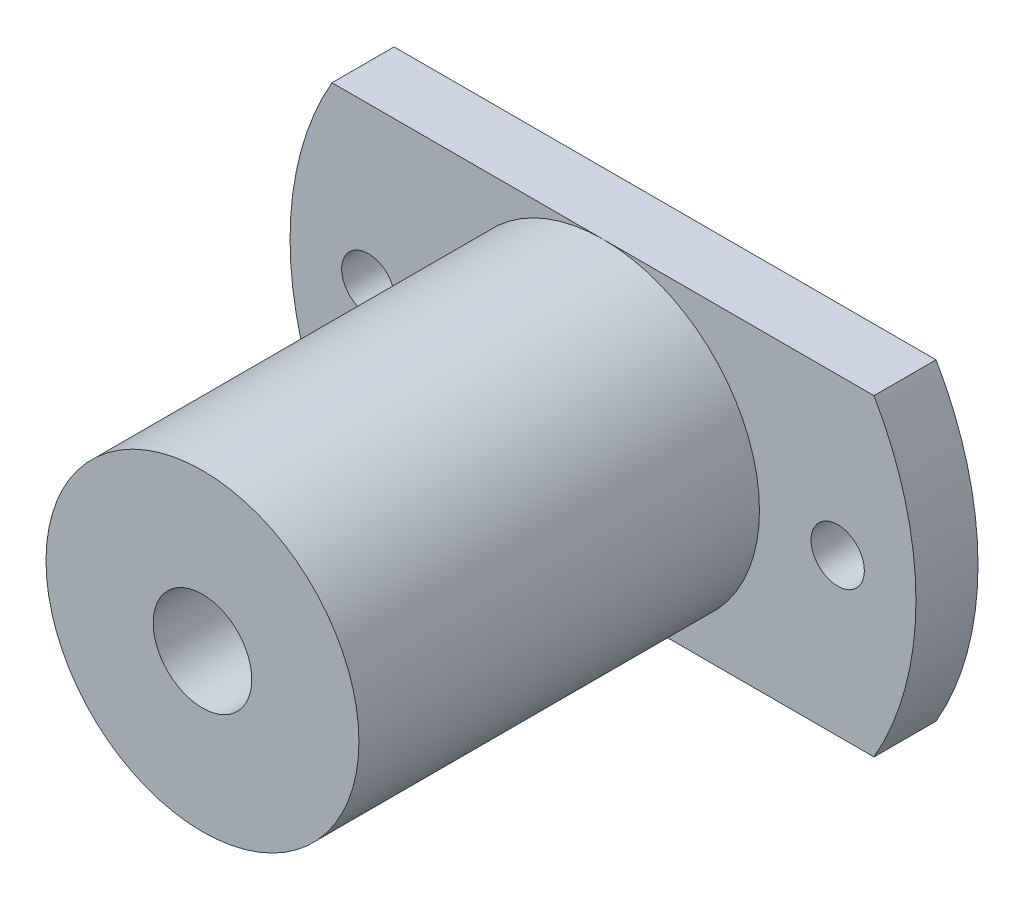
ISO-10303-21;
HEADER;
FILE_DESCRIPTION(('STEP AP214'),'2;1');
FILE_NAME('part.step','',(''),(''),'','','');
FILE_SCHEMA(('AUTOMOTIVE_DESIGN { 1 0 10303 214 1 1 1 1 }'));
ENDSEC;
DATA;
#1=APPLICATION_CONTEXT('core data for automotive mechanical design processes');
#2=APPLICATION_PROTOCOL_DEFINITION('international standard','automotive_design',2000,#1);
#3=PRODUCT_CONTEXT('',#1,'mechanical');
#4=PRODUCT('Part','Part','',(#3));
#5=PRODUCT_RELATED_PRODUCT_CATEGORY('part','',(#4));
#6=PRODUCT_DEFINITION_FORMATION('','',#4);
#7=PRODUCT_DEFINITION_CONTEXT('part definition',#1,'design');
#8=PRODUCT_DEFINITION('design','',#6,#7);
#9=PRODUCT_DEFINITION_SHAPE('','',#8);
#10=(LENGTH_UNIT() NAMED_UNIT(*) SI_UNIT(.MILLI.,.METRE.));
#11=(NAMED_UNIT(*) PLANE_ANGLE_UNIT() SI_UNIT($,.RADIAN.));
#12=(NAMED_UNIT(*) SI_UNIT($,.STERADIAN.) SOLID_ANGLE_UNIT());
#13=UNCERTAINTY_MEASURE_WITH_UNIT(LENGTH_MEASURE(1.E-05),#10,'distance_accuracy_value','');
#14=(GEOMETRIC_REPRESENTATION_CONTEXT(3) GLOBAL_UNCERTAINTY_ASSIGNED_CONTEXT((#13)) GLOBAL_UNIT_ASSIGNED_CONTEXT((#10,
#11,#12)) REPRESENTATION_CONTEXT('',''));
#15=CARTESIAN_POINT('',(0.,0.,0.));
#16=DIRECTION('',(0.,0.,1.));
#17=DIRECTION('',(1.,0.,0.));
#18=AXIS2_PLACEMENT_3D('',#15,#16,#17);
#19=CARTESIAN_POINT('',(0.,0.,23.4696));
#20=DIRECTION('',(0.,0.,-1.));
#21=DIRECTION('',(-1.,0.,0.));
#22=AXIS2_PLACEMENT_3D('',#19,#20,#21);
#23=CYLINDRICAL_SURFACE('',#22,15.875);
#24=CARTESIAN_POINT('',(0.,0.,3.1496));
#25=DIRECTION('',(0.,0.,1.));
#26=DIRECTION('',(1.,0.,0.));
#27=AXIS2_PLACEMENT_3D('',#24,#25,#26);
#28=CIRCLE('',#27,15.875);
#29=CARTESIAN_POINT('',(13.748153285078,-7.9375,3.1496));
#30=VERTEX_POINT('',#29);
#31=CARTESIAN_POINT('',(13.748153285078,7.9375,3.1496));
#32=VERTEX_POINT('',#31);
#33=EDGE_CURVE('E97',#30,#32,#28,.T.);
#34=ORIENTED_EDGE('',*,*,#33,.F.);
#35=DIRECTION('',(0.,0.,1.));
#36=VECTOR('',#35,1.);
#37=CARTESIAN_POINT('',(13.748153285078,-7.9375,0.));
#38=LINE('',#37,#36);
#39=CARTESIAN_POINT('',(13.748153285078,-7.9375,0.));
#40=VERTEX_POINT('',#39);
#41=EDGE_CURVE('E86',#40,#30,#38,.T.);
#42=ORIENTED_EDGE('',*,*,#41,.F.);
#43=CARTESIAN_POINT('',(0.,0.,0.));
#44=DIRECTION('',(0.,0.,1.));
#45=DIRECTION('',(1.,0.,0.));
#46=AXIS2_PLACEMENT_3D('',#43,#44,#45);
#47=CIRCLE('',#46,15.875);
#48=CARTESIAN_POINT('',(13.748153285078,7.9375,0.));
#49=VERTEX_POINT('',#48);
#50=EDGE_CURVE('E45',#40,#49,#47,.T.);
#51=ORIENTED_EDGE('',*,*,#50,.T.);
#52=DIRECTION('',(0.,0.,1.));
#53=VECTOR('',#52,1.);
#54=CARTESIAN_POINT('',(13.748153285078,7.9375,0.));
#55=LINE('',#54,#53);
#56=EDGE_CURVE('E132',#49,#32,#55,.T.);
#57=ORIENTED_EDGE('',*,*,#56,.T.);
#58=EDGE_LOOP('',(#34,#42,#51,#57));
#59=FACE_BOUND('',#58,.T.);
#60=ADVANCED_FACE('F37',(#59),#23,.T.);
#61=CARTESIAN_POINT('',(0.,0.,3.1496));
#62=DIRECTION('',(0.,0.,1.));
#63=DIRECTION('',(1.,0.,0.));
#64=AXIS2_PLACEMENT_3D('',#61,#62,#63);
#65=PLANE('',#64);
#66=DIRECTION('',(-1.,0.,0.));
#67=VECTOR('',#66,1.);
#68=CARTESIAN_POINT('',(-13.748153285078,-7.9375,3.1496));
#69=LINE('',#68,#67);
#70=CARTESIAN_POINT('',(0.,-7.9375,3.1496));
#71=VERTEX_POINT('',#70);
#72=EDGE_CURVE('E52',#30,#71,#69,.T.);
#73=ORIENTED_EDGE('',*,*,#72,.F.);
#74=ORIENTED_EDGE('',*,*,#33,.T.);
#75=DIRECTION('',(1.,0.,0.));
#76=VECTOR('',#75,1.);
#77=CARTESIAN_POINT('',(0.,7.9375,3.1496));
#78=LINE('',#77,#76);
#79=CARTESIAN_POINT('',(0.,7.9375,3.1496));
#80=VERTEX_POINT('',#79);
#81=EDGE_CURVE('E137',#80,#32,#78,.T.);
#82=ORIENTED_EDGE('',*,*,#81,.F.);
#83=CARTESIAN_POINT('',(0.,0.,3.1496));
#84=DIRECTION('',(0.,0.,1.));
#85=DIRECTION('',(1.,0.,0.));
#86=AXIS2_PLACEMENT_3D('',#83,#84,#85);
#87=CIRCLE('',#86,7.9375);
#88=EDGE_CURVE('E59',#71,#80,#87,.T.);
#89=ORIENTED_EDGE('',*,*,#88,.F.);
#90=EDGE_LOOP('',(#73,#74,#82,#89));
#91=FACE_BOUND('',#90,.T.);
#92=CARTESIAN_POINT('',(11.90625,0.,3.1496));
#93=DIRECTION('',(0.,0.,1.));
#94=DIRECTION('',(1.,0.,0.));
#95=AXIS2_PLACEMENT_3D('',#92,#93,#94);
#96=CIRCLE('',#95,1.35254999999999);
#97=CARTESIAN_POINT('',(13.2588,0.,3.1496));
#98=VERTEX_POINT('',#97);
#99=EDGE_CURVE('E128',#98,#98,#96,.T.);
#100=ORIENTED_EDGE('',*,*,#99,.F.);
#101=EDGE_LOOP('',(#100));
#102=FACE_BOUND('',#101,.T.);
#103=ADVANCED_FACE('F170',(#91,#102),#65,.T.);
#104=CARTESIAN_POINT('',(-13.748153285078,7.9375,0.));
#105=VERTEX_POINT('',#104);
#106=CARTESIAN_POINT('',(-13.748153285078,-7.9375,0.));
#107=VERTEX_POINT('',#106);
#108=EDGE_CURVE('E11',#105,#107,#47,.T.);
#109=ORIENTED_EDGE('',*,*,#108,.T.);
#110=DIRECTION('',(0.,0.,1.));
#111=VECTOR('',#110,1.);
#112=CARTESIAN_POINT('',(-13.748153285078,-7.9375,0.));
#113=LINE('',#112,#111);
#114=CARTESIAN_POINT('',(-13.748153285078,-7.9375,3.1496));
#115=VERTEX_POINT('',#114);
#116=EDGE_CURVE('E88',#107,#115,#113,.T.);
#117=ORIENTED_EDGE('',*,*,#116,.T.);
#118=CARTESIAN_POINT('',(-13.748153285078,7.9375,3.1496));
#119=VERTEX_POINT('',#118);
#120=EDGE_CURVE('E102',#119,#115,#28,.T.);
#121=ORIENTED_EDGE('',*,*,#120,.F.);
#122=DIRECTION('',(0.,0.,1.));
#123=VECTOR('',#122,1.);
#124=CARTESIAN_POINT('',(-13.748153285078,7.9375,0.));
#125=LINE('',#124,#123);
#126=EDGE_CURVE('E131',#105,#119,#125,.T.);
#127=ORIENTED_EDGE('',*,*,#126,.F.);
#128=EDGE_LOOP('',(#109,#117,#121,#127));
#129=FACE_BOUND('',#128,.T.);
#130=ADVANCED_FACE('F39',(#129),#23,.T.);
#131=CARTESIAN_POINT('',(0.,0.,0.));
#132=DIRECTION('',(0.,0.,1.));
#133=DIRECTION('',(1.,0.,0.));
#134=AXIS2_PLACEMENT_3D('',#131,#132,#133);
#135=PLANE('',#134);
#136=CARTESIAN_POINT('',(11.90625,0.,0.));
#137=DIRECTION('',(0.,0.,1.));
#138=DIRECTION('',(1.,0.,0.));
#139=AXIS2_PLACEMENT_3D('',#136,#137,#138);
#140=CIRCLE('',#139,1.35254999999999);
#141=CARTESIAN_POINT('',(13.2588,0.,0.));
#142=VERTEX_POINT('',#141);
#143=EDGE_CURVE('E125',#142,#142,#140,.T.);
#144=ORIENTED_EDGE('',*,*,#143,.T.);
#145=EDGE_LOOP('',(#144));
#146=FACE_BOUND('',#145,.T.);
#147=CARTESIAN_POINT('',(-11.90625,0.,0.));
#148=DIRECTION('',(0.,0.,1.));
#149=DIRECTION('',(1.,0.,0.));
#150=AXIS2_PLACEMENT_3D('',#147,#148,#149);
#151=CIRCLE('',#150,1.35254999999999);
#152=CARTESIAN_POINT('',(-10.5537,0.,0.));
#153=VERTEX_POINT('',#152);
#154=EDGE_CURVE('E119',#153,#153,#151,.T.);
#155=ORIENTED_EDGE('',*,*,#154,.T.);
#156=EDGE_LOOP('',(#155));
#157=FACE_BOUND('',#156,.T.);
#158=CARTESIAN_POINT('',(0.,0.,0.));
#159=DIRECTION('',(0.,0.,1.));
#160=DIRECTION('',(1.,0.,0.));
#161=AXIS2_PLACEMENT_3D('',#158,#159,#160);
#162=CIRCLE('',#161,2.5);
#163=CARTESIAN_POINT('',(2.5,0.,0.));
#164=VERTEX_POINT('',#163);
#165=EDGE_CURVE('E112',#164,#164,#162,.T.);
#166=ORIENTED_EDGE('',*,*,#165,.T.);
#167=EDGE_LOOP('',(#166));
#168=FACE_BOUND('',#167,.T.);
#169=ORIENTED_EDGE('',*,*,#50,.F.);
#170=DIRECTION('',(-1.,0.,0.));
#171=VECTOR('',#170,1.);
#172=CARTESIAN_POINT('',(-13.748153285078,-7.9375,0.));
#173=LINE('',#172,#171);
#174=EDGE_CURVE('E83',#40,#107,#173,.T.);
#175=ORIENTED_EDGE('',*,*,#174,.T.);
#176=ORIENTED_EDGE('',*,*,#108,.F.);
#177=DIRECTION('',(1.,0.,0.));
#178=VECTOR('',#177,1.);
#179=CARTESIAN_POINT('',(0.,7.9375,0.));
#180=LINE('',#179,#178);
#181=EDGE_CURVE('E101',#105,#49,#180,.T.);
#182=ORIENTED_EDGE('',*,*,#181,.T.);
#183=EDGE_LOOP('',(#169,#175,#176,#182));
#184=FACE_BOUND('',#183,.T.);
#185=ADVANCED_FACE('F100',(#146,#157,#168,#184),#135,.F.);
#186=EDGE_CURVE('E140',#71,#115,#69,.T.);
#187=ORIENTED_EDGE('',*,*,#186,.F.);
#188=EDGE_CURVE('E107',#80,#71,#87,.T.);
#189=ORIENTED_EDGE('',*,*,#188,.F.);
#190=EDGE_CURVE('E135',#119,#80,#78,.T.);
#191=ORIENTED_EDGE('',*,*,#190,.F.);
#192=ORIENTED_EDGE('',*,*,#120,.T.);
#193=EDGE_LOOP('',(#187,#189,#191,#192));
#194=FACE_BOUND('',#193,.T.);
#195=CARTESIAN_POINT('',(-11.90625,0.,3.1496));
#196=DIRECTION('',(0.,0.,1.));
#197=DIRECTION('',(1.,0.,0.));
#198=AXIS2_PLACEMENT_3D('',#195,#196,#197);
#199=CIRCLE('',#198,1.35254999999999);
#200=CARTESIAN_POINT('',(-10.5537,0.,3.1496));
#201=VERTEX_POINT('',#200);
#202=EDGE_CURVE('E122',#201,#201,#199,.T.);
#203=ORIENTED_EDGE('',*,*,#202,.F.);
#204=EDGE_LOOP('',(#203));
#205=FACE_BOUND('',#204,.T.);
#206=ADVANCED_FACE('F148',(#194,#205),#65,.T.);
#207=CARTESIAN_POINT('',(0.,0.,3.1496));
#208=DIRECTION('',(0.,0.,1.));
#209=DIRECTION('',(1.,0.,0.));
#210=AXIS2_PLACEMENT_3D('',#207,#208,#209);
#211=CYLINDRICAL_SURFACE('',#210,7.9375);
#212=ORIENTED_EDGE('',*,*,#188,.T.);
#213=ORIENTED_EDGE('',*,*,#88,.T.);
#214=EDGE_LOOP('',(#212,#213));
#215=FACE_BOUND('',#214,.T.);
#216=CARTESIAN_POINT('',(0.,0.,23.4696));
#217=DIRECTION('',(0.,0.,1.));
#218=DIRECTION('',(1.,0.,0.));
#219=AXIS2_PLACEMENT_3D('',#216,#217,#218);
#220=CIRCLE('',#219,7.9375);
#221=CARTESIAN_POINT('',(7.9375,0.,23.4696));
#222=VERTEX_POINT('',#221);
#223=EDGE_CURVE('E109',#222,#222,#220,.T.);
#224=ORIENTED_EDGE('',*,*,#223,.F.);
#225=EDGE_LOOP('',(#224));
#226=FACE_BOUND('',#225,.T.);
#227=ADVANCED_FACE('F150',(#215,#226),#211,.T.);
#228=CARTESIAN_POINT('',(0.,0.,23.4696));
#229=DIRECTION('',(0.,0.,1.));
#230=DIRECTION('',(1.,0.,0.));
#231=AXIS2_PLACEMENT_3D('',#228,#229,#230);
#232=PLANE('',#231);
#233=CARTESIAN_POINT('',(0.,0.,23.4696));
#234=DIRECTION('',(0.,0.,1.));
#235=DIRECTION('',(1.,0.,0.));
#236=AXIS2_PLACEMENT_3D('',#233,#234,#235);
#237=CIRCLE('',#236,2.49999999999999);
#238=CARTESIAN_POINT('',(2.49999999999999,0.,23.4696));
#239=VERTEX_POINT('',#238);
#240=EDGE_CURVE('E116',#239,#239,#237,.T.);
#241=ORIENTED_EDGE('',*,*,#240,.F.);
#242=EDGE_LOOP('',(#241));
#243=FACE_BOUND('',#242,.T.);
#244=ORIENTED_EDGE('',*,*,#223,.T.);
#245=EDGE_LOOP('',(#244));
#246=FACE_BOUND('',#245,.T.);
#247=ADVANCED_FACE('F153',(#243,#246),#232,.T.);
#248=CARTESIAN_POINT('',(0.,0.,23.4696));
#249=DIRECTION('',(0.,0.,1.));
#250=DIRECTION('',(1.,0.,0.));
#251=AXIS2_PLACEMENT_3D('',#248,#249,#250);
#252=CYLINDRICAL_SURFACE('',#251,2.49999999999999);
#253=ORIENTED_EDGE('',*,*,#165,.F.);
#254=EDGE_LOOP('',(#253));
#255=FACE_BOUND('',#254,.T.);
#256=ORIENTED_EDGE('',*,*,#240,.T.);
#257=EDGE_LOOP('',(#256));
#258=FACE_BOUND('',#257,.T.);
#259=ADVANCED_FACE('F158',(#255,#258),#252,.F.);
#260=CARTESIAN_POINT('',(-11.90625,0.,3.1496));
#261=DIRECTION('',(0.,0.,1.));
#262=DIRECTION('',(1.,0.,0.));
#263=AXIS2_PLACEMENT_3D('',#260,#261,#262);
#264=CYLINDRICAL_SURFACE('',#263,1.35254999999999);
#265=ORIENTED_EDGE('',*,*,#202,.T.);
#266=EDGE_LOOP('',(#265));
#267=FACE_BOUND('',#266,.T.);
#268=ORIENTED_EDGE('',*,*,#154,.F.);
#269=EDGE_LOOP('',(#268));
#270=FACE_BOUND('',#269,.T.);
#271=ADVANCED_FACE('F164',(#267,#270),#264,.F.);
#272=CARTESIAN_POINT('',(11.90625,0.,3.1496));
#273=DIRECTION('',(0.,0.,1.));
#274=DIRECTION('',(1.,0.,0.));
#275=AXIS2_PLACEMENT_3D('',#272,#273,#274);
#276=CYLINDRICAL_SURFACE('',#275,1.35254999999999);
#277=ORIENTED_EDGE('',*,*,#99,.T.);
#278=EDGE_LOOP('',(#277));
#279=FACE_BOUND('',#278,.T.);
#280=ORIENTED_EDGE('',*,*,#143,.F.);
#281=EDGE_LOOP('',(#280));
#282=FACE_BOUND('',#281,.T.);
#283=ADVANCED_FACE('F191',(#279,#282),#276,.F.);
#284=CARTESIAN_POINT('',(0.,7.9375,0.));
#285=DIRECTION('',(0.,-1.,0.));
#286=DIRECTION('',(1.,0.,0.));
#287=AXIS2_PLACEMENT_3D('',#284,#285,#286);
#288=PLANE('',#287);
#289=ORIENTED_EDGE('',*,*,#190,.T.);
#290=ORIENTED_EDGE('',*,*,#81,.T.);
#291=ORIENTED_EDGE('',*,*,#56,.F.);
#292=ORIENTED_EDGE('',*,*,#181,.F.);
#293=ORIENTED_EDGE('',*,*,#126,.T.);
#294=EDGE_LOOP('',(#289,#290,#291,#292,#293));
#295=FACE_BOUND('',#294,.T.);
#296=ADVANCED_FACE('F145',(#295),#288,.F.);
#297=CARTESIAN_POINT('',(-13.748153285078,-7.9375,0.));
#298=DIRECTION('',(0.,1.,0.));
#299=DIRECTION('',(0.,0.,1.));
#300=AXIS2_PLACEMENT_3D('',#297,#298,#299);
#301=PLANE('',#300);
#302=ORIENTED_EDGE('',*,*,#72,.T.);
#303=ORIENTED_EDGE('',*,*,#186,.T.);
#304=ORIENTED_EDGE('',*,*,#116,.F.);
#305=ORIENTED_EDGE('',*,*,#174,.F.);
#306=ORIENTED_EDGE('',*,*,#41,.T.);
#307=EDGE_LOOP('',(#302,#303,#304,#305,#306));
#308=FACE_BOUND('',#307,.T.);
#309=ADVANCED_FACE('F85',(#308),#301,.F.);
#310=CLOSED_SHELL('',(#60,#103,#130,#185,#206,#227,#247,#259,#271,#283,#296,#309));
#311=MANIFOLD_SOLID_BREP('B2',#310);
#312=ADVANCED_BREP_SHAPE_REPRESENTATION('',(#18,#311),#14);
#313=SHAPE_DEFINITION_REPRESENTATION(#9,#312);
ENDSEC;
END-ISO-10303-21;
